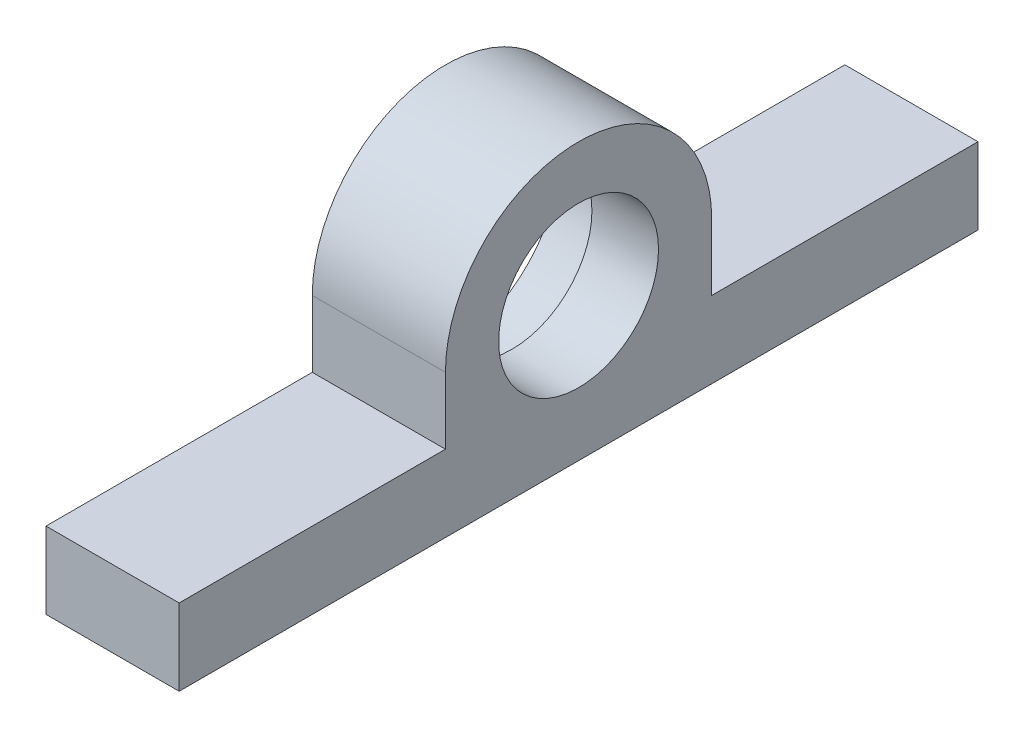
ISO-10303-21;
HEADER;
FILE_DESCRIPTION(('STEP AP214'),'2;1');
FILE_NAME('part.step','',(''),(''),'','','');
FILE_SCHEMA(('AUTOMOTIVE_DESIGN { 1 0 10303 214 1 1 1 1 }'));
ENDSEC;
DATA;
#1=APPLICATION_CONTEXT('core data for automotive mechanical design processes');
#2=APPLICATION_PROTOCOL_DEFINITION('international standard','automotive_design',2000,#1);
#3=PRODUCT_CONTEXT('',#1,'mechanical');
#4=PRODUCT('Part','Part','',(#3));
#5=PRODUCT_RELATED_PRODUCT_CATEGORY('part','',(#4));
#6=PRODUCT_DEFINITION_FORMATION('','',#4);
#7=PRODUCT_DEFINITION_CONTEXT('part definition',#1,'design');
#8=PRODUCT_DEFINITION('design','',#6,#7);
#9=PRODUCT_DEFINITION_SHAPE('','',#8);
#10=(LENGTH_UNIT() NAMED_UNIT(*) SI_UNIT(.MILLI.,.METRE.));
#11=(NAMED_UNIT(*) PLANE_ANGLE_UNIT() SI_UNIT($,.RADIAN.));
#12=(NAMED_UNIT(*) SI_UNIT($,.STERADIAN.) SOLID_ANGLE_UNIT());
#13=UNCERTAINTY_MEASURE_WITH_UNIT(LENGTH_MEASURE(1.E-05),#10,'distance_accuracy_value','');
#14=(GEOMETRIC_REPRESENTATION_CONTEXT(3) GLOBAL_UNCERTAINTY_ASSIGNED_CONTEXT((#13)) GLOBAL_UNIT_ASSIGNED_CONTEXT((#10,
#11,#12)) REPRESENTATION_CONTEXT('',''));
#15=CARTESIAN_POINT('',(0.,0.,0.));
#16=DIRECTION('',(0.,0.,1.));
#17=DIRECTION('',(1.,0.,0.));
#18=AXIS2_PLACEMENT_3D('',#15,#16,#17);
#19=CARTESIAN_POINT('',(0.,13.65,-38.1));
#20=DIRECTION('',(1.,0.,0.));
#21=DIRECTION('',(0.,0.,-1.));
#22=AXIS2_PLACEMENT_3D('',#19,#20,#21);
#23=CYLINDRICAL_SURFACE('',#22,7.62500003999999);
#24=CARTESIAN_POINT('',(12.7,13.65,-38.1));
#25=DIRECTION('',(1.,0.,0.));
#26=DIRECTION('',(0.,0.,-1.));
#27=AXIS2_PLACEMENT_3D('',#24,#25,#26);
#28=CIRCLE('',#27,7.62500003999999);
#29=CARTESIAN_POINT('',(12.7,13.65,-45.72500004));
#30=VERTEX_POINT('',#29);
#31=EDGE_CURVE('E139',#30,#30,#28,.T.);
#32=ORIENTED_EDGE('',*,*,#31,.T.);
#33=EDGE_LOOP('',(#32));
#34=FACE_BOUND('',#33,.T.);
#35=CARTESIAN_POINT('',(6.35,13.65,-38.1));
#36=DIRECTION('',(-1.,0.,0.));
#37=DIRECTION('',(0.,0.,1.));
#38=AXIS2_PLACEMENT_3D('',#35,#36,#37);
#39=CIRCLE('',#38,7.62500003999999);
#40=CARTESIAN_POINT('',(6.35,13.65,-30.47499996));
#41=VERTEX_POINT('',#40);
#42=EDGE_CURVE('E41',#41,#41,#39,.F.);
#43=ORIENTED_EDGE('',*,*,#42,.F.);
#44=EDGE_LOOP('',(#43));
#45=FACE_BOUND('',#44,.T.);
#46=ADVANCED_FACE('F37',(#34,#45),#23,.F.);
#47=CARTESIAN_POINT('',(12.7,7.3,0.));
#48=DIRECTION('',(0.,0.,-1.));
#49=DIRECTION('',(0.,1.,0.));
#50=AXIS2_PLACEMENT_3D('',#47,#48,#49);
#51=PLANE('',#50);
#52=DIRECTION('',(0.,-1.,0.));
#53=VECTOR('',#52,1.);
#54=CARTESIAN_POINT('',(0.,7.3,0.));
#55=LINE('',#54,#53);
#56=CARTESIAN_POINT('',(0.,7.3,0.));
#57=VERTEX_POINT('',#56);
#58=CARTESIAN_POINT('',(0.,0.,0.));
#59=VERTEX_POINT('',#58);
#60=EDGE_CURVE('E135',#57,#59,#55,.T.);
#61=ORIENTED_EDGE('',*,*,#60,.T.);
#62=DIRECTION('',(-1.,0.,0.));
#63=VECTOR('',#62,1.);
#64=CARTESIAN_POINT('',(12.7,0.,0.));
#65=LINE('',#64,#63);
#66=CARTESIAN_POINT('',(12.7,0.,0.));
#67=VERTEX_POINT('',#66);
#68=EDGE_CURVE('E11',#67,#59,#65,.T.);
#69=ORIENTED_EDGE('',*,*,#68,.F.);
#70=DIRECTION('',(0.,-1.,0.));
#71=VECTOR('',#70,1.);
#72=CARTESIAN_POINT('',(12.7,7.3,0.));
#73=LINE('',#72,#71);
#74=CARTESIAN_POINT('',(12.7,7.3,0.));
#75=VERTEX_POINT('',#74);
#76=EDGE_CURVE('E150',#75,#67,#73,.T.);
#77=ORIENTED_EDGE('',*,*,#76,.F.);
#78=DIRECTION('',(-1.,0.,0.));
#79=VECTOR('',#78,1.);
#80=CARTESIAN_POINT('',(12.7,7.3,0.));
#81=LINE('',#80,#79);
#82=EDGE_CURVE('E131',#75,#57,#81,.T.);
#83=ORIENTED_EDGE('',*,*,#82,.T.);
#84=EDGE_LOOP('',(#61,#69,#77,#83));
#85=FACE_BOUND('',#84,.T.);
#86=ADVANCED_FACE('F39',(#85),#51,.F.);
#87=CARTESIAN_POINT('',(12.7,0.,0.));
#88=DIRECTION('',(0.,1.,0.));
#89=DIRECTION('',(0.,0.,1.));
#90=AXIS2_PLACEMENT_3D('',#87,#88,#89);
#91=PLANE('',#90);
#92=CARTESIAN_POINT('',(6.35,0.,-12.7));
#93=DIRECTION('',(0.,-1.,0.));
#94=DIRECTION('',(0.,0.,-1.));
#95=AXIS2_PLACEMENT_3D('',#92,#93,#94);
#96=CIRCLE('',#95,2.);
#97=CARTESIAN_POINT('',(6.35,0.,-14.7));
#98=VERTEX_POINT('',#97);
#99=EDGE_CURVE('E193',#98,#98,#96,.T.);
#100=ORIENTED_EDGE('',*,*,#99,.F.);
#101=EDGE_LOOP('',(#100));
#102=FACE_BOUND('',#101,.T.);
#103=CARTESIAN_POINT('',(6.35,0.,-63.5));
#104=DIRECTION('',(0.,-1.,0.));
#105=DIRECTION('',(0.,0.,-1.));
#106=AXIS2_PLACEMENT_3D('',#103,#104,#105);
#107=CIRCLE('',#106,2.);
#108=CARTESIAN_POINT('',(6.35,0.,-65.5));
#109=VERTEX_POINT('',#108);
#110=EDGE_CURVE('E190',#109,#109,#107,.T.);
#111=ORIENTED_EDGE('',*,*,#110,.F.);
#112=EDGE_LOOP('',(#111));
#113=FACE_BOUND('',#112,.T.);
#114=DIRECTION('',(0.,0.,-1.));
#115=VECTOR('',#114,1.);
#116=CARTESIAN_POINT('',(0.,0.,0.));
#117=LINE('',#116,#115);
#118=CARTESIAN_POINT('',(0.,0.,-76.2));
#119=VERTEX_POINT('',#118);
#120=EDGE_CURVE('E138',#59,#119,#117,.T.);
#121=ORIENTED_EDGE('',*,*,#120,.T.);
#122=DIRECTION('',(-1.,0.,0.));
#123=VECTOR('',#122,1.);
#124=CARTESIAN_POINT('',(12.7,0.,-76.2));
#125=LINE('',#124,#123);
#126=CARTESIAN_POINT('',(12.7,0.,-76.2));
#127=VERTEX_POINT('',#126);
#128=EDGE_CURVE('E47',#127,#119,#125,.T.);
#129=ORIENTED_EDGE('',*,*,#128,.F.);
#130=DIRECTION('',(0.,0.,-1.));
#131=VECTOR('',#130,1.);
#132=CARTESIAN_POINT('',(12.7,0.,0.));
#133=LINE('',#132,#131);
#134=EDGE_CURVE('E98',#67,#127,#133,.T.);
#135=ORIENTED_EDGE('',*,*,#134,.F.);
#136=ORIENTED_EDGE('',*,*,#68,.T.);
#137=EDGE_LOOP('',(#121,#129,#135,#136));
#138=FACE_BOUND('',#137,.T.);
#139=ADVANCED_FACE('F218',(#102,#113,#138),#91,.F.);
#140=CARTESIAN_POINT('',(12.7,0.,-76.2));
#141=DIRECTION('',(0.,0.,1.));
#142=DIRECTION('',(1.,0.,0.));
#143=AXIS2_PLACEMENT_3D('',#140,#141,#142);
#144=PLANE('',#143);
#145=DIRECTION('',(0.,1.,0.));
#146=VECTOR('',#145,1.);
#147=CARTESIAN_POINT('',(0.,0.,-76.2));
#148=LINE('',#147,#146);
#149=CARTESIAN_POINT('',(0.,7.30000000000001,-76.2));
#150=VERTEX_POINT('',#149);
#151=EDGE_CURVE('E141',#119,#150,#148,.T.);
#152=ORIENTED_EDGE('',*,*,#151,.T.);
#153=DIRECTION('',(-1.,0.,0.));
#154=VECTOR('',#153,1.);
#155=CARTESIAN_POINT('',(12.7,7.30000000000001,-76.2));
#156=LINE('',#155,#154);
#157=CARTESIAN_POINT('',(12.7,7.30000000000001,-76.2));
#158=VERTEX_POINT('',#157);
#159=EDGE_CURVE('E157',#158,#150,#156,.T.);
#160=ORIENTED_EDGE('',*,*,#159,.F.);
#161=DIRECTION('',(0.,1.,0.));
#162=VECTOR('',#161,1.);
#163=CARTESIAN_POINT('',(12.7,0.,-76.2));
#164=LINE('',#163,#162);
#165=EDGE_CURVE('E166',#127,#158,#164,.T.);
#166=ORIENTED_EDGE('',*,*,#165,.F.);
#167=ORIENTED_EDGE('',*,*,#128,.T.);
#168=EDGE_LOOP('',(#152,#160,#166,#167));
#169=FACE_BOUND('',#168,.T.);
#170=ADVANCED_FACE('F164',(#169),#144,.F.);
#171=CARTESIAN_POINT('',(12.7,7.30000000000001,-76.2));
#172=DIRECTION('',(0.,-1.,0.));
#173=DIRECTION('',(0.,0.,-1.));
#174=AXIS2_PLACEMENT_3D('',#171,#172,#173);
#175=PLANE('',#174);
#176=DIRECTION('',(0.,0.,1.));
#177=VECTOR('',#176,1.);
#178=CARTESIAN_POINT('',(0.,7.30000000000001,-76.2));
#179=LINE('',#178,#177);
#180=CARTESIAN_POINT('',(0.,7.30000000000001,-50.8));
#181=VERTEX_POINT('',#180);
#182=EDGE_CURVE('E143',#150,#181,#179,.T.);
#183=ORIENTED_EDGE('',*,*,#182,.T.);
#184=DIRECTION('',(-1.,0.,0.));
#185=VECTOR('',#184,1.);
#186=CARTESIAN_POINT('',(12.7,7.30000000000001,-50.8));
#187=LINE('',#186,#185);
#188=CARTESIAN_POINT('',(12.7,7.30000000000001,-50.8));
#189=VERTEX_POINT('',#188);
#190=EDGE_CURVE('E154',#189,#181,#187,.T.);
#191=ORIENTED_EDGE('',*,*,#190,.F.);
#192=DIRECTION('',(0.,0.,1.));
#193=VECTOR('',#192,1.);
#194=CARTESIAN_POINT('',(12.7,7.30000000000001,-76.2));
#195=LINE('',#194,#193);
#196=EDGE_CURVE('E178',#158,#189,#195,.T.);
#197=ORIENTED_EDGE('',*,*,#196,.F.);
#198=ORIENTED_EDGE('',*,*,#159,.T.);
#199=EDGE_LOOP('',(#183,#191,#197,#198));
#200=FACE_BOUND('',#199,.T.);
#201=ADVANCED_FACE('F174',(#200),#175,.F.);
#202=CARTESIAN_POINT('',(12.7,7.30000000000001,-50.8));
#203=DIRECTION('',(0.,0.,1.));
#204=DIRECTION('',(0.,-1.,0.));
#205=AXIS2_PLACEMENT_3D('',#202,#203,#204);
#206=PLANE('',#205);
#207=DIRECTION('',(0.,1.,0.));
#208=VECTOR('',#207,1.);
#209=CARTESIAN_POINT('',(0.,7.30000000000001,-50.8));
#210=LINE('',#209,#208);
#211=CARTESIAN_POINT('',(0.,13.65,-50.8));
#212=VERTEX_POINT('',#211);
#213=EDGE_CURVE('E145',#181,#212,#210,.T.);
#214=ORIENTED_EDGE('',*,*,#213,.T.);
#215=DIRECTION('',(-1.,0.,0.));
#216=VECTOR('',#215,1.);
#217=CARTESIAN_POINT('',(12.7,13.65,-50.8));
#218=LINE('',#217,#216);
#219=CARTESIAN_POINT('',(12.7,13.65,-50.8));
#220=VERTEX_POINT('',#219);
#221=EDGE_CURVE('E126',#220,#212,#218,.T.);
#222=ORIENTED_EDGE('',*,*,#221,.F.);
#223=DIRECTION('',(0.,1.,0.));
#224=VECTOR('',#223,1.);
#225=CARTESIAN_POINT('',(12.7,7.30000000000001,-50.8));
#226=LINE('',#225,#224);
#227=EDGE_CURVE('E117',#189,#220,#226,.T.);
#228=ORIENTED_EDGE('',*,*,#227,.F.);
#229=ORIENTED_EDGE('',*,*,#190,.T.);
#230=EDGE_LOOP('',(#214,#222,#228,#229));
#231=FACE_BOUND('',#230,.T.);
#232=ADVANCED_FACE('F177',(#231),#206,.F.);
#233=CARTESIAN_POINT('',(12.7,13.65,-38.1));
#234=DIRECTION('',(-1.,0.,0.));
#235=DIRECTION('',(0.,0.,1.));
#236=AXIS2_PLACEMENT_3D('',#233,#234,#235);
#237=CYLINDRICAL_SURFACE('',#236,12.7);
#238=CARTESIAN_POINT('',(0.,13.65,-38.1));
#239=DIRECTION('',(1.,0.,0.));
#240=DIRECTION('',(0.,0.,-1.));
#241=AXIS2_PLACEMENT_3D('',#238,#239,#240);
#242=CIRCLE('',#241,12.7);
#243=CARTESIAN_POINT('',(0.,13.65,-25.4));
#244=VERTEX_POINT('',#243);
#245=EDGE_CURVE('E125',#212,#244,#242,.T.);
#246=ORIENTED_EDGE('',*,*,#245,.T.);
#247=DIRECTION('',(-1.,0.,0.));
#248=VECTOR('',#247,1.);
#249=CARTESIAN_POINT('',(12.7,13.65,-25.4));
#250=LINE('',#249,#248);
#251=CARTESIAN_POINT('',(12.7,13.65,-25.4));
#252=VERTEX_POINT('',#251);
#253=EDGE_CURVE('E122',#252,#244,#250,.T.);
#254=ORIENTED_EDGE('',*,*,#253,.F.);
#255=CARTESIAN_POINT('',(12.7,13.65,-38.1));
#256=DIRECTION('',(1.,0.,0.));
#257=DIRECTION('',(0.,0.,-1.));
#258=AXIS2_PLACEMENT_3D('',#255,#256,#257);
#259=CIRCLE('',#258,12.7);
#260=EDGE_CURVE('E111',#220,#252,#259,.T.);
#261=ORIENTED_EDGE('',*,*,#260,.F.);
#262=ORIENTED_EDGE('',*,*,#221,.T.);
#263=EDGE_LOOP('',(#246,#254,#261,#262));
#264=FACE_BOUND('',#263,.T.);
#265=ADVANCED_FACE('F123',(#264),#237,.T.);
#266=CARTESIAN_POINT('',(12.7,13.65,-25.4));
#267=DIRECTION('',(0.,0.,-1.));
#268=DIRECTION('',(-1.,0.,0.));
#269=AXIS2_PLACEMENT_3D('',#266,#267,#268);
#270=PLANE('',#269);
#271=DIRECTION('',(0.,-1.,0.));
#272=VECTOR('',#271,1.);
#273=CARTESIAN_POINT('',(0.,13.65,-25.4));
#274=LINE('',#273,#272);
#275=CARTESIAN_POINT('',(0.,7.3,-25.4));
#276=VERTEX_POINT('',#275);
#277=EDGE_CURVE('E84',#244,#276,#274,.T.);
#278=ORIENTED_EDGE('',*,*,#277,.T.);
#279=DIRECTION('',(-1.,0.,0.));
#280=VECTOR('',#279,1.);
#281=CARTESIAN_POINT('',(12.7,7.3,-25.4));
#282=LINE('',#281,#280);
#283=CARTESIAN_POINT('',(12.7,7.3,-25.4));
#284=VERTEX_POINT('',#283);
#285=EDGE_CURVE('E127',#284,#276,#282,.T.);
#286=ORIENTED_EDGE('',*,*,#285,.F.);
#287=DIRECTION('',(0.,-1.,0.));
#288=VECTOR('',#287,1.);
#289=CARTESIAN_POINT('',(12.7,13.65,-25.4));
#290=LINE('',#289,#288);
#291=EDGE_CURVE('E115',#252,#284,#290,.T.);
#292=ORIENTED_EDGE('',*,*,#291,.F.);
#293=ORIENTED_EDGE('',*,*,#253,.T.);
#294=EDGE_LOOP('',(#278,#286,#292,#293));
#295=FACE_BOUND('',#294,.T.);
#296=ADVANCED_FACE('F129',(#295),#270,.F.);
#297=CARTESIAN_POINT('',(12.7,7.3,-25.4));
#298=DIRECTION('',(0.,-1.,0.));
#299=DIRECTION('',(0.,0.,-1.));
#300=AXIS2_PLACEMENT_3D('',#297,#298,#299);
#301=PLANE('',#300);
#302=DIRECTION('',(0.,0.,1.));
#303=VECTOR('',#302,1.);
#304=CARTESIAN_POINT('',(0.,7.3,-25.4));
#305=LINE('',#304,#303);
#306=EDGE_CURVE('E90',#276,#57,#305,.T.);
#307=ORIENTED_EDGE('',*,*,#306,.T.);
#308=ORIENTED_EDGE('',*,*,#82,.F.);
#309=DIRECTION('',(0.,0.,1.));
#310=VECTOR('',#309,1.);
#311=CARTESIAN_POINT('',(12.7,7.3,-25.4));
#312=LINE('',#311,#310);
#313=EDGE_CURVE('E55',#284,#75,#312,.T.);
#314=ORIENTED_EDGE('',*,*,#313,.F.);
#315=ORIENTED_EDGE('',*,*,#285,.T.);
#316=EDGE_LOOP('',(#307,#308,#314,#315));
#317=FACE_BOUND('',#316,.T.);
#318=ADVANCED_FACE('F226',(#317),#301,.F.);
#319=CARTESIAN_POINT('',(12.7,13.65,-38.1));
#320=DIRECTION('',(1.,0.,0.));
#321=DIRECTION('',(0.,0.,-1.));
#322=AXIS2_PLACEMENT_3D('',#319,#320,#321);
#323=PLANE('',#322);
#324=ORIENTED_EDGE('',*,*,#31,.F.);
#325=EDGE_LOOP('',(#324));
#326=FACE_BOUND('',#325,.T.);
#327=ORIENTED_EDGE('',*,*,#76,.T.);
#328=ORIENTED_EDGE('',*,*,#134,.T.);
#329=ORIENTED_EDGE('',*,*,#165,.T.);
#330=ORIENTED_EDGE('',*,*,#196,.T.);
#331=ORIENTED_EDGE('',*,*,#227,.T.);
#332=ORIENTED_EDGE('',*,*,#260,.T.);
#333=ORIENTED_EDGE('',*,*,#291,.T.);
#334=ORIENTED_EDGE('',*,*,#313,.T.);
#335=EDGE_LOOP('',(#327,#328,#329,#330,#331,#332,#333,#334));
#336=FACE_BOUND('',#335,.T.);
#337=ADVANCED_FACE('F113',(#326,#336),#323,.T.);
#338=CARTESIAN_POINT('',(0.,13.65,-38.1));
#339=DIRECTION('',(1.,0.,0.));
#340=DIRECTION('',(0.,0.,-1.));
#341=AXIS2_PLACEMENT_3D('',#338,#339,#340);
#342=PLANE('',#341);
#343=CARTESIAN_POINT('',(0.,13.65,-38.1));
#344=DIRECTION('',(-1.,0.,0.));
#345=DIRECTION('',(0.,0.,1.));
#346=AXIS2_PLACEMENT_3D('',#343,#344,#345);
#347=CIRCLE('',#346,11.);
#348=CARTESIAN_POINT('',(0.,13.65,-27.1));
#349=VERTEX_POINT('',#348);
#350=EDGE_CURVE('E198',#349,#349,#347,.T.);
#351=ORIENTED_EDGE('',*,*,#350,.F.);
#352=EDGE_LOOP('',(#351));
#353=FACE_BOUND('',#352,.T.);
#354=ORIENTED_EDGE('',*,*,#60,.F.);
#355=ORIENTED_EDGE('',*,*,#306,.F.);
#356=ORIENTED_EDGE('',*,*,#277,.F.);
#357=ORIENTED_EDGE('',*,*,#245,.F.);
#358=ORIENTED_EDGE('',*,*,#213,.F.);
#359=ORIENTED_EDGE('',*,*,#182,.F.);
#360=ORIENTED_EDGE('',*,*,#151,.F.);
#361=ORIENTED_EDGE('',*,*,#120,.F.);
#362=EDGE_LOOP('',(#354,#355,#356,#357,#358,#359,#360,#361));
#363=FACE_BOUND('',#362,.T.);
#364=ADVANCED_FACE('F170',(#353,#363),#342,.F.);
#365=CARTESIAN_POINT('',(6.35,7.,-63.5));
#366=DIRECTION('',(0.,-1.,0.));
#367=DIRECTION('',(0.,0.,-1.));
#368=AXIS2_PLACEMENT_3D('',#365,#366,#367);
#369=CYLINDRICAL_SURFACE('',#368,2.);
#370=CARTESIAN_POINT('',(6.35,7.,-63.5));
#371=DIRECTION('',(0.,-1.,0.));
#372=DIRECTION('',(0.,0.,-1.));
#373=AXIS2_PLACEMENT_3D('',#370,#371,#372);
#374=CIRCLE('',#373,2.);
#375=CARTESIAN_POINT('',(6.35,7.,-65.5));
#376=VERTEX_POINT('',#375);
#377=EDGE_CURVE('E187',#376,#376,#374,.T.);
#378=ORIENTED_EDGE('',*,*,#377,.F.);
#379=EDGE_LOOP('',(#378));
#380=FACE_BOUND('',#379,.T.);
#381=ORIENTED_EDGE('',*,*,#110,.T.);
#382=EDGE_LOOP('',(#381));
#383=FACE_BOUND('',#382,.T.);
#384=ADVANCED_FACE('F229',(#380,#383),#369,.F.);
#385=CARTESIAN_POINT('',(6.35,7.,-63.5));
#386=DIRECTION('',(0.,-1.,0.));
#387=DIRECTION('',(0.,0.,-1.));
#388=AXIS2_PLACEMENT_3D('',#385,#386,#387);
#389=PLANE('',#388);
#390=ORIENTED_EDGE('',*,*,#377,.T.);
#391=EDGE_LOOP('',(#390));
#392=FACE_BOUND('',#391,.T.);
#393=ADVANCED_FACE('F222',(#392),#389,.T.);
#394=CARTESIAN_POINT('',(6.35,7.,-12.7));
#395=DIRECTION('',(0.,-1.,0.));
#396=DIRECTION('',(0.,0.,-1.));
#397=AXIS2_PLACEMENT_3D('',#394,#395,#396);
#398=CYLINDRICAL_SURFACE('',#397,2.);
#399=CARTESIAN_POINT('',(6.35,7.,-12.7));
#400=DIRECTION('',(0.,-1.,0.));
#401=DIRECTION('',(0.,0.,-1.));
#402=AXIS2_PLACEMENT_3D('',#399,#400,#401);
#403=CIRCLE('',#402,2.);
#404=CARTESIAN_POINT('',(6.35,7.,-14.7));
#405=VERTEX_POINT('',#404);
#406=EDGE_CURVE('E186',#405,#405,#403,.T.);
#407=ORIENTED_EDGE('',*,*,#406,.F.);
#408=EDGE_LOOP('',(#407));
#409=FACE_BOUND('',#408,.T.);
#410=ORIENTED_EDGE('',*,*,#99,.T.);
#411=EDGE_LOOP('',(#410));
#412=FACE_BOUND('',#411,.T.);
#413=ADVANCED_FACE('F258',(#409,#412),#398,.F.);
#414=CARTESIAN_POINT('',(6.35,7.,-12.7));
#415=DIRECTION('',(0.,-1.,0.));
#416=DIRECTION('',(0.,0.,-1.));
#417=AXIS2_PLACEMENT_3D('',#414,#415,#416);
#418=PLANE('',#417);
#419=ORIENTED_EDGE('',*,*,#406,.T.);
#420=EDGE_LOOP('',(#419));
#421=FACE_BOUND('',#420,.T.);
#422=ADVANCED_FACE('F264',(#421),#418,.T.);
#423=CARTESIAN_POINT('',(6.35,13.65,-38.1));
#424=DIRECTION('',(-1.,0.,0.));
#425=DIRECTION('',(0.,0.,1.));
#426=AXIS2_PLACEMENT_3D('',#423,#424,#425);
#427=PLANE('',#426);
#428=CARTESIAN_POINT('',(6.35,13.65,-38.1));
#429=DIRECTION('',(-1.,0.,0.));
#430=DIRECTION('',(0.,0.,1.));
#431=AXIS2_PLACEMENT_3D('',#428,#429,#430);
#432=CIRCLE('',#431,11.);
#433=CARTESIAN_POINT('',(6.35,13.65,-27.1));
#434=VERTEX_POINT('',#433);
#435=EDGE_CURVE('E201',#434,#434,#432,.T.);
#436=ORIENTED_EDGE('',*,*,#435,.T.);
#437=EDGE_LOOP('',(#436));
#438=FACE_BOUND('',#437,.T.);
#439=ORIENTED_EDGE('',*,*,#42,.T.);
#440=EDGE_LOOP('',(#439));
#441=FACE_BOUND('',#440,.T.);
#442=ADVANCED_FACE('F208',(#438,#441),#427,.T.);
#443=CARTESIAN_POINT('',(6.35,13.65,-38.1));
#444=DIRECTION('',(-1.,0.,0.));
#445=DIRECTION('',(0.,0.,1.));
#446=AXIS2_PLACEMENT_3D('',#443,#444,#445);
#447=CYLINDRICAL_SURFACE('',#446,11.);
#448=ORIENTED_EDGE('',*,*,#435,.F.);
#449=EDGE_LOOP('',(#448));
#450=FACE_BOUND('',#449,.T.);
#451=ORIENTED_EDGE('',*,*,#350,.T.);
#452=EDGE_LOOP('',(#451));
#453=FACE_BOUND('',#452,.T.);
#454=ADVANCED_FACE('F269',(#450,#453),#447,.F.);
#455=CLOSED_SHELL('',(#46,#86,#139,#170,#201,#232,#265,#296,#318,#337,#364,#384,#393,#413,#422,
#442,#454));
#456=MANIFOLD_SOLID_BREP('B2',#455);
#457=ADVANCED_BREP_SHAPE_REPRESENTATION('',(#18,#456),#14);
#458=SHAPE_DEFINITION_REPRESENTATION(#9,#457);
ENDSEC;
END-ISO-10303-21;
